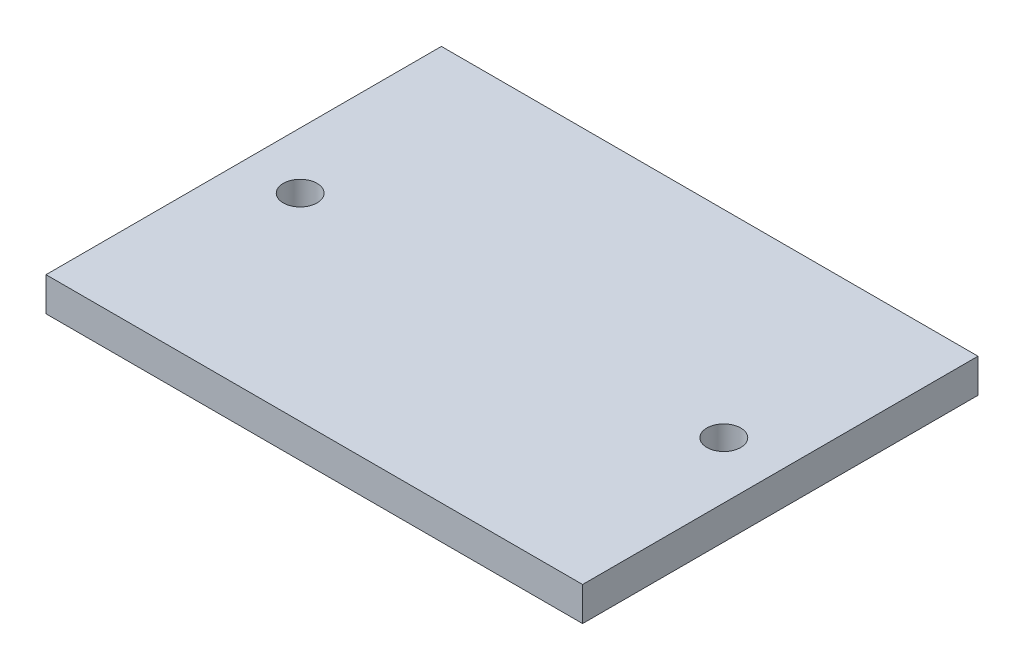
ISO-10303-21;
HEADER;
FILE_DESCRIPTION(('STEP AP214'),'2;1');
FILE_NAME('part.step','',(''),(''),'','','');
FILE_SCHEMA(('AUTOMOTIVE_DESIGN { 1 0 10303 214 1 1 1 1 }'));
ENDSEC;
DATA;
#1=APPLICATION_CONTEXT('core data for automotive mechanical design processes');
#2=APPLICATION_PROTOCOL_DEFINITION('international standard','automotive_design',2000,#1);
#3=PRODUCT_CONTEXT('',#1,'mechanical');
#4=PRODUCT('Part','Part','',(#3));
#5=PRODUCT_RELATED_PRODUCT_CATEGORY('part','',(#4));
#6=PRODUCT_DEFINITION_FORMATION('','',#4);
#7=PRODUCT_DEFINITION_CONTEXT('part definition',#1,'design');
#8=PRODUCT_DEFINITION('design','',#6,#7);
#9=PRODUCT_DEFINITION_SHAPE('','',#8);
#10=(LENGTH_UNIT() NAMED_UNIT(*) SI_UNIT(.MILLI.,.METRE.));
#11=(NAMED_UNIT(*) PLANE_ANGLE_UNIT() SI_UNIT($,.RADIAN.));
#12=(NAMED_UNIT(*) SI_UNIT($,.STERADIAN.) SOLID_ANGLE_UNIT());
#13=UNCERTAINTY_MEASURE_WITH_UNIT(LENGTH_MEASURE(1.E-05),#10,'distance_accuracy_value','');
#14=(GEOMETRIC_REPRESENTATION_CONTEXT(3) GLOBAL_UNCERTAINTY_ASSIGNED_CONTEXT((#13)) GLOBAL_UNIT_ASSIGNED_CONTEXT((#10,
#11,#12)) REPRESENTATION_CONTEXT('',''));
#15=CARTESIAN_POINT('',(0.,0.,0.));
#16=DIRECTION('',(0.,0.,1.));
#17=DIRECTION('',(1.,0.,0.));
#18=AXIS2_PLACEMENT_3D('',#15,#16,#17);
#19=CARTESIAN_POINT('',(0.,3.,0.));
#20=DIRECTION('',(0.,-1.,0.));
#21=DIRECTION('',(0.,0.,-1.));
#22=AXIS2_PLACEMENT_3D('',#19,#20,#21);
#23=PLANE('',#22);
#24=DIRECTION('',(0.,0.,1.));
#25=VECTOR('',#24,1.);
#26=CARTESIAN_POINT('',(0.,3.,0.));
#27=LINE('',#26,#25);
#28=CARTESIAN_POINT('',(0.,3.,-35.));
#29=VERTEX_POINT('',#28);
#30=CARTESIAN_POINT('',(0.,3.,0.));
#31=VERTEX_POINT('',#30);
#32=EDGE_CURVE('E85',#29,#31,#27,.T.);
#33=ORIENTED_EDGE('',*,*,#32,.T.);
#34=DIRECTION('',(1.,0.,0.));
#35=VECTOR('',#34,1.);
#36=CARTESIAN_POINT('',(0.,3.,0.));
#37=LINE('',#36,#35);
#38=CARTESIAN_POINT('',(47.5,3.,0.));
#39=VERTEX_POINT('',#38);
#40=EDGE_CURVE('E80',#31,#39,#37,.T.);
#41=ORIENTED_EDGE('',*,*,#40,.T.);
#42=DIRECTION('',(0.,0.,-1.));
#43=VECTOR('',#42,1.);
#44=CARTESIAN_POINT('',(47.5,3.,0.));
#45=LINE('',#44,#43);
#46=CARTESIAN_POINT('',(47.5,3.,-35.));
#47=VERTEX_POINT('',#46);
#48=EDGE_CURVE('E83',#39,#47,#45,.T.);
#49=ORIENTED_EDGE('',*,*,#48,.T.);
#50=DIRECTION('',(-1.,0.,0.));
#51=VECTOR('',#50,1.);
#52=CARTESIAN_POINT('',(0.,3.,-35.));
#53=LINE('',#52,#51);
#54=EDGE_CURVE('E50',#47,#29,#53,.T.);
#55=ORIENTED_EDGE('',*,*,#54,.T.);
#56=EDGE_LOOP('',(#33,#41,#49,#55));
#57=FACE_BOUND('',#56,.T.);
#58=CARTESIAN_POINT('',(42.5,3.,-17.5));
#59=DIRECTION('',(0.,1.,0.));
#60=DIRECTION('',(0.,0.,1.));
#61=AXIS2_PLACEMENT_3D('',#58,#59,#60);
#62=CIRCLE('',#61,1.49999999999999);
#63=CARTESIAN_POINT('',(42.5,3.,-16.));
#64=VERTEX_POINT('',#63);
#65=EDGE_CURVE('E113',#64,#64,#62,.T.);
#66=ORIENTED_EDGE('',*,*,#65,.F.);
#67=EDGE_LOOP('',(#66));
#68=FACE_BOUND('',#67,.T.);
#69=CARTESIAN_POINT('',(5.,3.,-17.5));
#70=DIRECTION('',(0.,1.,0.));
#71=DIRECTION('',(0.,0.,1.));
#72=AXIS2_PLACEMENT_3D('',#69,#70,#71);
#73=CIRCLE('',#72,1.5);
#74=CARTESIAN_POINT('',(5.,3.,-16.));
#75=VERTEX_POINT('',#74);
#76=EDGE_CURVE('E119',#75,#75,#73,.T.);
#77=ORIENTED_EDGE('',*,*,#76,.F.);
#78=EDGE_LOOP('',(#77));
#79=FACE_BOUND('',#78,.T.);
#80=ADVANCED_FACE('F33',(#57,#68,#79),#23,.F.);
#81=CARTESIAN_POINT('',(0.,3.,0.));
#82=DIRECTION('',(1.,0.,0.));
#83=DIRECTION('',(0.,0.,-1.));
#84=AXIS2_PLACEMENT_3D('',#81,#82,#83);
#85=PLANE('',#84);
#86=DIRECTION('',(0.,0.,1.));
#87=VECTOR('',#86,1.);
#88=CARTESIAN_POINT('',(0.,0.,0.));
#89=LINE('',#88,#87);
#90=CARTESIAN_POINT('',(0.,0.,-35.));
#91=VERTEX_POINT('',#90);
#92=CARTESIAN_POINT('',(0.,0.,0.));
#93=VERTEX_POINT('',#92);
#94=EDGE_CURVE('E97',#91,#93,#89,.T.);
#95=ORIENTED_EDGE('',*,*,#94,.T.);
#96=DIRECTION('',(0.,-1.,0.));
#97=VECTOR('',#96,1.);
#98=CARTESIAN_POINT('',(0.,3.,0.));
#99=LINE('',#98,#97);
#100=EDGE_CURVE('E11',#31,#93,#99,.T.);
#101=ORIENTED_EDGE('',*,*,#100,.F.);
#102=ORIENTED_EDGE('',*,*,#32,.F.);
#103=DIRECTION('',(0.,-1.,0.));
#104=VECTOR('',#103,1.);
#105=CARTESIAN_POINT('',(0.,3.,-35.));
#106=LINE('',#105,#104);
#107=EDGE_CURVE('E93',#29,#91,#106,.T.);
#108=ORIENTED_EDGE('',*,*,#107,.T.);
#109=EDGE_LOOP('',(#95,#101,#102,#108));
#110=FACE_BOUND('',#109,.T.);
#111=ADVANCED_FACE('F35',(#110),#85,.F.);
#112=CARTESIAN_POINT('',(0.,3.,0.));
#113=DIRECTION('',(0.,0.,-1.));
#114=DIRECTION('',(-1.,0.,0.));
#115=AXIS2_PLACEMENT_3D('',#112,#113,#114);
#116=PLANE('',#115);
#117=DIRECTION('',(1.,0.,0.));
#118=VECTOR('',#117,1.);
#119=CARTESIAN_POINT('',(0.,0.,0.));
#120=LINE('',#119,#118);
#121=CARTESIAN_POINT('',(47.5,0.,0.));
#122=VERTEX_POINT('',#121);
#123=EDGE_CURVE('E89',#93,#122,#120,.T.);
#124=ORIENTED_EDGE('',*,*,#123,.T.);
#125=DIRECTION('',(0.,-1.,0.));
#126=VECTOR('',#125,1.);
#127=CARTESIAN_POINT('',(47.5,3.,0.));
#128=LINE('',#127,#126);
#129=EDGE_CURVE('E42',#39,#122,#128,.T.);
#130=ORIENTED_EDGE('',*,*,#129,.F.);
#131=ORIENTED_EDGE('',*,*,#40,.F.);
#132=ORIENTED_EDGE('',*,*,#100,.T.);
#133=EDGE_LOOP('',(#124,#130,#131,#132));
#134=FACE_BOUND('',#133,.T.);
#135=ADVANCED_FACE('F88',(#134),#116,.F.);
#136=CARTESIAN_POINT('',(47.5,3.,0.));
#137=DIRECTION('',(-1.,0.,0.));
#138=DIRECTION('',(0.,0.,1.));
#139=AXIS2_PLACEMENT_3D('',#136,#137,#138);
#140=PLANE('',#139);
#141=DIRECTION('',(0.,0.,-1.));
#142=VECTOR('',#141,1.);
#143=CARTESIAN_POINT('',(47.5,0.,0.));
#144=LINE('',#143,#142);
#145=CARTESIAN_POINT('',(47.5,0.,-35.));
#146=VERTEX_POINT('',#145);
#147=EDGE_CURVE('E67',#122,#146,#144,.T.);
#148=ORIENTED_EDGE('',*,*,#147,.T.);
#149=DIRECTION('',(0.,-1.,0.));
#150=VECTOR('',#149,1.);
#151=CARTESIAN_POINT('',(47.5,3.,-35.));
#152=LINE('',#151,#150);
#153=EDGE_CURVE('E90',#47,#146,#152,.T.);
#154=ORIENTED_EDGE('',*,*,#153,.F.);
#155=ORIENTED_EDGE('',*,*,#48,.F.);
#156=ORIENTED_EDGE('',*,*,#129,.T.);
#157=EDGE_LOOP('',(#148,#154,#155,#156));
#158=FACE_BOUND('',#157,.T.);
#159=ADVANCED_FACE('F91',(#158),#140,.F.);
#160=CARTESIAN_POINT('',(0.,3.,-35.));
#161=DIRECTION('',(0.,0.,1.));
#162=DIRECTION('',(1.,0.,0.));
#163=AXIS2_PLACEMENT_3D('',#160,#161,#162);
#164=PLANE('',#163);
#165=DIRECTION('',(-1.,0.,0.));
#166=VECTOR('',#165,1.);
#167=CARTESIAN_POINT('',(0.,0.,-35.));
#168=LINE('',#167,#166);
#169=EDGE_CURVE('E73',#146,#91,#168,.T.);
#170=ORIENTED_EDGE('',*,*,#169,.T.);
#171=ORIENTED_EDGE('',*,*,#107,.F.);
#172=ORIENTED_EDGE('',*,*,#54,.F.);
#173=ORIENTED_EDGE('',*,*,#153,.T.);
#174=EDGE_LOOP('',(#170,#171,#172,#173));
#175=FACE_BOUND('',#174,.T.);
#176=ADVANCED_FACE('F105',(#175),#164,.F.);
#177=CARTESIAN_POINT('',(0.,0.,0.));
#178=DIRECTION('',(0.,-1.,0.));
#179=DIRECTION('',(0.,0.,-1.));
#180=AXIS2_PLACEMENT_3D('',#177,#178,#179);
#181=PLANE('',#180);
#182=CARTESIAN_POINT('',(5.,0.,-17.5));
#183=DIRECTION('',(0.,-1.,0.));
#184=DIRECTION('',(0.,0.,-1.));
#185=AXIS2_PLACEMENT_3D('',#182,#183,#184);
#186=CIRCLE('',#185,1.5);
#187=CARTESIAN_POINT('',(5.,0.,-19.));
#188=VERTEX_POINT('',#187);
#189=EDGE_CURVE('E116',#188,#188,#186,.T.);
#190=ORIENTED_EDGE('',*,*,#189,.F.);
#191=EDGE_LOOP('',(#190));
#192=FACE_BOUND('',#191,.T.);
#193=CARTESIAN_POINT('',(42.5,0.,-17.5));
#194=DIRECTION('',(0.,-1.,0.));
#195=DIRECTION('',(0.,0.,-1.));
#196=AXIS2_PLACEMENT_3D('',#193,#194,#195);
#197=CIRCLE('',#196,1.5);
#198=CARTESIAN_POINT('',(42.5,0.,-19.));
#199=VERTEX_POINT('',#198);
#200=EDGE_CURVE('E100',#199,#199,#197,.T.);
#201=ORIENTED_EDGE('',*,*,#200,.F.);
#202=EDGE_LOOP('',(#201));
#203=FACE_BOUND('',#202,.T.);
#204=ORIENTED_EDGE('',*,*,#94,.F.);
#205=ORIENTED_EDGE('',*,*,#169,.F.);
#206=ORIENTED_EDGE('',*,*,#147,.F.);
#207=ORIENTED_EDGE('',*,*,#123,.F.);
#208=EDGE_LOOP('',(#204,#205,#206,#207));
#209=FACE_BOUND('',#208,.T.);
#210=ADVANCED_FACE('F108',(#192,#203,#209),#181,.T.);
#211=CARTESIAN_POINT('',(42.5,3.,-17.5));
#212=DIRECTION('',(0.,1.,0.));
#213=DIRECTION('',(0.,0.,1.));
#214=AXIS2_PLACEMENT_3D('',#211,#212,#213);
#215=CYLINDRICAL_SURFACE('',#214,1.5);
#216=ORIENTED_EDGE('',*,*,#65,.T.);
#217=EDGE_LOOP('',(#216));
#218=FACE_BOUND('',#217,.T.);
#219=ORIENTED_EDGE('',*,*,#200,.T.);
#220=EDGE_LOOP('',(#219));
#221=FACE_BOUND('',#220,.T.);
#222=ADVANCED_FACE('F133',(#218,#221),#215,.F.);
#223=CARTESIAN_POINT('',(5.,3.,-17.5));
#224=DIRECTION('',(0.,1.,0.));
#225=DIRECTION('',(0.,0.,1.));
#226=AXIS2_PLACEMENT_3D('',#223,#224,#225);
#227=CYLINDRICAL_SURFACE('',#226,1.5);
#228=ORIENTED_EDGE('',*,*,#76,.T.);
#229=EDGE_LOOP('',(#228));
#230=FACE_BOUND('',#229,.T.);
#231=ORIENTED_EDGE('',*,*,#189,.T.);
#232=EDGE_LOOP('',(#231));
#233=FACE_BOUND('',#232,.T.);
#234=ADVANCED_FACE('F123',(#230,#233),#227,.F.);
#235=CLOSED_SHELL('',(#80,#111,#135,#159,#176,#210,#222,#234));
#236=MANIFOLD_SOLID_BREP('B2',#235);
#237=ADVANCED_BREP_SHAPE_REPRESENTATION('',(#18,#236),#14);
#238=SHAPE_DEFINITION_REPRESENTATION(#9,#237);
ENDSEC;
END-ISO-10303-21;
